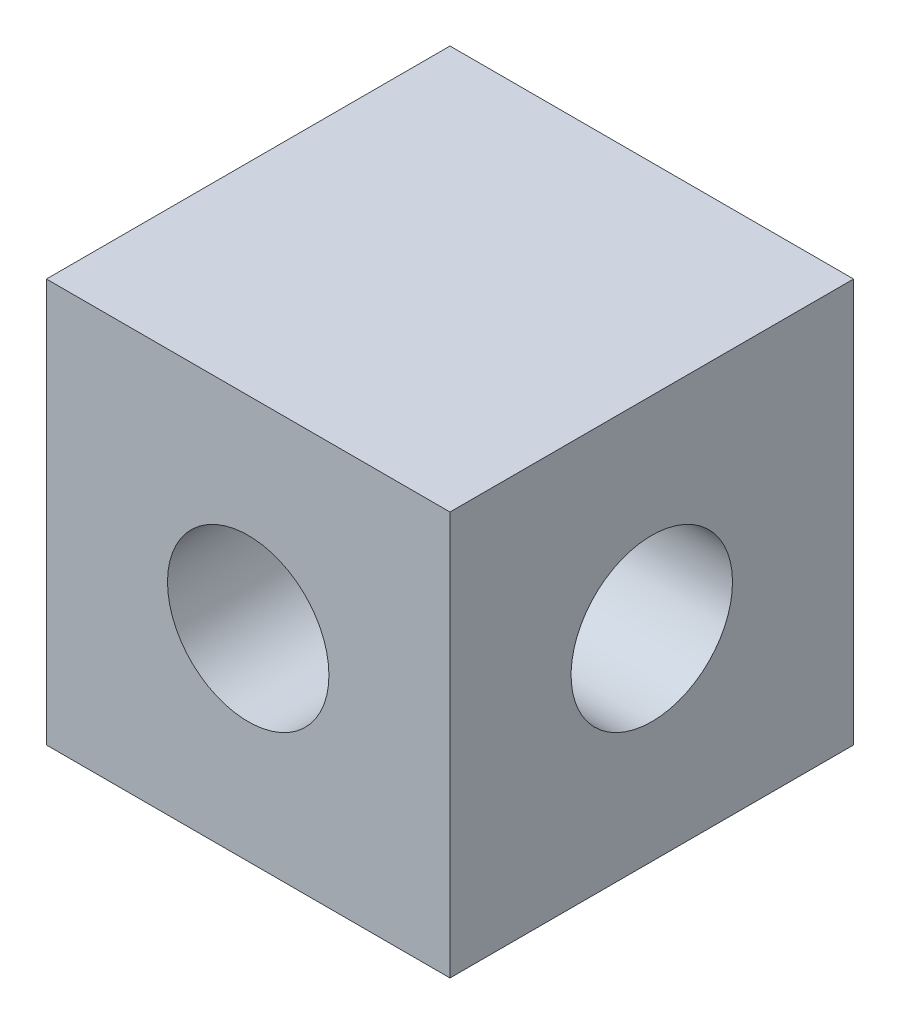
ISO-10303-21;
HEADER;
FILE_DESCRIPTION(('STEP AP214'),'2;1');
FILE_NAME('part.step','',(''),(''),'','','');
FILE_SCHEMA(('AUTOMOTIVE_DESIGN { 1 0 10303 214 1 1 1 1 }'));
ENDSEC;
DATA;
#1=APPLICATION_CONTEXT('core data for automotive mechanical design processes');
#2=APPLICATION_PROTOCOL_DEFINITION('international standard','automotive_design',2000,#1);
#3=PRODUCT_CONTEXT('',#1,'mechanical');
#4=PRODUCT('Part','Part','',(#3));
#5=PRODUCT_RELATED_PRODUCT_CATEGORY('part','',(#4));
#6=PRODUCT_DEFINITION_FORMATION('','',#4);
#7=PRODUCT_DEFINITION_CONTEXT('part definition',#1,'design');
#8=PRODUCT_DEFINITION('design','',#6,#7);
#9=PRODUCT_DEFINITION_SHAPE('','',#8);
#10=(LENGTH_UNIT() NAMED_UNIT(*) SI_UNIT(.MILLI.,.METRE.));
#11=(NAMED_UNIT(*) PLANE_ANGLE_UNIT() SI_UNIT($,.RADIAN.));
#12=(NAMED_UNIT(*) SI_UNIT($,.STERADIAN.) SOLID_ANGLE_UNIT());
#13=UNCERTAINTY_MEASURE_WITH_UNIT(LENGTH_MEASURE(1.E-05),#10,'distance_accuracy_value','');
#14=(GEOMETRIC_REPRESENTATION_CONTEXT(3) GLOBAL_UNCERTAINTY_ASSIGNED_CONTEXT((#13)) GLOBAL_UNIT_ASSIGNED_CONTEXT((#10,
#11,#12)) REPRESENTATION_CONTEXT('',''));
#15=CARTESIAN_POINT('',(0.,0.,0.));
#16=DIRECTION('',(0.,0.,1.));
#17=DIRECTION('',(1.,0.,0.));
#18=AXIS2_PLACEMENT_3D('',#15,#16,#17);
#19=CARTESIAN_POINT('',(10.,0.,0.));
#20=DIRECTION('',(-1.,0.,0.));
#21=DIRECTION('',(0.,0.,1.));
#22=AXIS2_PLACEMENT_3D('',#19,#20,#21);
#23=CYLINDRICAL_SURFACE('',#22,2.);
#24=CARTESIAN_POINT('',(5.,0.,0.));
#25=DIRECTION('',(-0.707106781186547,0.,-0.707106781186547));
#26=DIRECTION('',(-0.707106781186547,0.,0.707106781186547));
#27=AXIS2_PLACEMENT_3D('',#24,#25,#26);
#28=ELLIPSE('',#27,2.82842712474619,2.);
#29=CARTESIAN_POINT('',(5.,-2.,0.));
#30=VERTEX_POINT('',#29);
#31=CARTESIAN_POINT('',(5.,2.,0.));
#32=VERTEX_POINT('',#31);
#33=EDGE_CURVE('E11',#30,#32,#28,.F.);
#34=ORIENTED_EDGE('',*,*,#33,.F.);
#35=CARTESIAN_POINT('',(5.,0.,0.));
#36=DIRECTION('',(-0.707106781186547,0.,0.707106781186547));
#37=DIRECTION('',(-0.707106781186547,0.,-0.707106781186547));
#38=AXIS2_PLACEMENT_3D('',#35,#36,#37);
#39=ELLIPSE('',#38,2.82842712474619,2.);
#40=EDGE_CURVE('E47',#32,#30,#39,.F.);
#41=ORIENTED_EDGE('',*,*,#40,.F.);
#42=EDGE_LOOP('',(#34,#41));
#43=FACE_BOUND('',#42,.T.);
#44=CARTESIAN_POINT('',(10.,0.,0.));
#45=DIRECTION('',(1.,0.,0.));
#46=DIRECTION('',(0.,0.,-1.));
#47=AXIS2_PLACEMENT_3D('',#44,#45,#46);
#48=CIRCLE('',#47,2.);
#49=CARTESIAN_POINT('',(10.,0.,-2.));
#50=VERTEX_POINT('',#49);
#51=EDGE_CURVE('E122',#50,#50,#48,.T.);
#52=ORIENTED_EDGE('',*,*,#51,.T.);
#53=EDGE_LOOP('',(#52));
#54=FACE_BOUND('',#53,.T.);
#55=ADVANCED_FACE('F33',(#43,#54),#23,.F.);
#56=CARTESIAN_POINT('',(10.,0.,0.));
#57=DIRECTION('',(-1.,0.,0.));
#58=DIRECTION('',(0.,0.,1.));
#59=AXIS2_PLACEMENT_3D('',#56,#57,#58);
#60=PLANE('',#59);
#61=DIRECTION('',(0.,1.,0.));
#62=VECTOR('',#61,1.);
#63=CARTESIAN_POINT('',(10.,-5.,-5.));
#64=LINE('',#63,#62);
#65=CARTESIAN_POINT('',(10.,-5.,-5.));
#66=VERTEX_POINT('',#65);
#67=CARTESIAN_POINT('',(10.,5.,-5.));
#68=VERTEX_POINT('',#67);
#69=EDGE_CURVE('E114',#66,#68,#64,.T.);
#70=ORIENTED_EDGE('',*,*,#69,.T.);
#71=DIRECTION('',(0.,0.,1.));
#72=VECTOR('',#71,1.);
#73=CARTESIAN_POINT('',(10.,5.,5.));
#74=LINE('',#73,#72);
#75=CARTESIAN_POINT('',(10.,5.,5.));
#76=VERTEX_POINT('',#75);
#77=EDGE_CURVE('E85',#68,#76,#74,.T.);
#78=ORIENTED_EDGE('',*,*,#77,.T.);
#79=DIRECTION('',(0.,-1.,0.));
#80=VECTOR('',#79,1.);
#81=CARTESIAN_POINT('',(10.,-5.,5.));
#82=LINE('',#81,#80);
#83=CARTESIAN_POINT('',(10.,-5.,5.));
#84=VERTEX_POINT('',#83);
#85=EDGE_CURVE('E124',#76,#84,#82,.T.);
#86=ORIENTED_EDGE('',*,*,#85,.T.);
#87=DIRECTION('',(0.,0.,-1.));
#88=VECTOR('',#87,1.);
#89=CARTESIAN_POINT('',(10.,-5.,5.));
#90=LINE('',#89,#88);
#91=EDGE_CURVE('E56',#84,#66,#90,.T.);
#92=ORIENTED_EDGE('',*,*,#91,.T.);
#93=EDGE_LOOP('',(#70,#78,#86,#92));
#94=FACE_BOUND('',#93,.T.);
#95=ORIENTED_EDGE('',*,*,#51,.F.);
#96=EDGE_LOOP('',(#95));
#97=FACE_BOUND('',#96,.T.);
#98=ADVANCED_FACE('F152',(#94,#97),#60,.F.);
#99=CARTESIAN_POINT('',(0.,0.,0.));
#100=DIRECTION('',(-1.,0.,0.));
#101=DIRECTION('',(0.,0.,1.));
#102=AXIS2_PLACEMENT_3D('',#99,#100,#101);
#103=PLANE('',#102);
#104=DIRECTION('',(0.,1.,0.));
#105=VECTOR('',#104,1.);
#106=CARTESIAN_POINT('',(0.,-5.,-5.));
#107=LINE('',#106,#105);
#108=CARTESIAN_POINT('',(0.,-5.,-5.));
#109=VERTEX_POINT('',#108);
#110=CARTESIAN_POINT('',(0.,5.,-5.));
#111=VERTEX_POINT('',#110);
#112=EDGE_CURVE('E119',#109,#111,#107,.T.);
#113=ORIENTED_EDGE('',*,*,#112,.F.);
#114=DIRECTION('',(0.,0.,-1.));
#115=VECTOR('',#114,1.);
#116=CARTESIAN_POINT('',(0.,-5.,5.));
#117=LINE('',#116,#115);
#118=CARTESIAN_POINT('',(0.,-5.,5.));
#119=VERTEX_POINT('',#118);
#120=EDGE_CURVE('E77',#119,#109,#117,.T.);
#121=ORIENTED_EDGE('',*,*,#120,.F.);
#122=DIRECTION('',(0.,-1.,0.));
#123=VECTOR('',#122,1.);
#124=CARTESIAN_POINT('',(0.,-5.,5.));
#125=LINE('',#124,#123);
#126=CARTESIAN_POINT('',(0.,5.,5.));
#127=VERTEX_POINT('',#126);
#128=EDGE_CURVE('E115',#127,#119,#125,.T.);
#129=ORIENTED_EDGE('',*,*,#128,.F.);
#130=DIRECTION('',(0.,0.,1.));
#131=VECTOR('',#130,1.);
#132=CARTESIAN_POINT('',(0.,5.,5.));
#133=LINE('',#132,#131);
#134=EDGE_CURVE('E117',#111,#127,#133,.T.);
#135=ORIENTED_EDGE('',*,*,#134,.F.);
#136=EDGE_LOOP('',(#113,#121,#129,#135));
#137=FACE_BOUND('',#136,.T.);
#138=CARTESIAN_POINT('',(0.,0.,0.));
#139=DIRECTION('',(1.,0.,0.));
#140=DIRECTION('',(0.,0.,-1.));
#141=AXIS2_PLACEMENT_3D('',#138,#139,#140);
#142=CIRCLE('',#141,2.);
#143=CARTESIAN_POINT('',(0.,0.,-2.));
#144=VERTEX_POINT('',#143);
#145=EDGE_CURVE('E128',#144,#144,#142,.T.);
#146=ORIENTED_EDGE('',*,*,#145,.T.);
#147=EDGE_LOOP('',(#146));
#148=FACE_BOUND('',#147,.T.);
#149=ADVANCED_FACE('F158',(#137,#148),#103,.T.);
#150=CARTESIAN_POINT('',(10.,-5.,-5.));
#151=DIRECTION('',(0.,0.,1.));
#152=DIRECTION('',(1.,0.,0.));
#153=AXIS2_PLACEMENT_3D('',#150,#151,#152);
#154=PLANE('',#153);
#155=CARTESIAN_POINT('',(5.,0.,-5.));
#156=DIRECTION('',(0.,0.,-1.));
#157=DIRECTION('',(-1.,0.,0.));
#158=AXIS2_PLACEMENT_3D('',#155,#156,#157);
#159=CIRCLE('',#158,2.);
#160=CARTESIAN_POINT('',(3.,0.,-5.));
#161=VERTEX_POINT('',#160);
#162=EDGE_CURVE('E134',#161,#161,#159,.T.);
#163=ORIENTED_EDGE('',*,*,#162,.F.);
#164=EDGE_LOOP('',(#163));
#165=FACE_BOUND('',#164,.T.);
#166=ORIENTED_EDGE('',*,*,#112,.T.);
#167=DIRECTION('',(-1.,0.,0.));
#168=VECTOR('',#167,1.);
#169=CARTESIAN_POINT('',(10.,5.,-5.));
#170=LINE('',#169,#168);
#171=EDGE_CURVE('E99',#68,#111,#170,.T.);
#172=ORIENTED_EDGE('',*,*,#171,.F.);
#173=ORIENTED_EDGE('',*,*,#69,.F.);
#174=DIRECTION('',(-1.,0.,0.));
#175=VECTOR('',#174,1.);
#176=CARTESIAN_POINT('',(10.,-5.,-5.));
#177=LINE('',#176,#175);
#178=EDGE_CURVE('E111',#66,#109,#177,.T.);
#179=ORIENTED_EDGE('',*,*,#178,.T.);
#180=EDGE_LOOP('',(#166,#172,#173,#179));
#181=FACE_BOUND('',#180,.T.);
#182=ADVANCED_FACE('F35',(#165,#181),#154,.F.);
#183=CARTESIAN_POINT('',(10.,5.,5.));
#184=DIRECTION('',(0.,-1.,0.));
#185=DIRECTION('',(0.,0.,-1.));
#186=AXIS2_PLACEMENT_3D('',#183,#184,#185);
#187=PLANE('',#186);
#188=ORIENTED_EDGE('',*,*,#134,.T.);
#189=DIRECTION('',(-1.,0.,0.));
#190=VECTOR('',#189,1.);
#191=CARTESIAN_POINT('',(10.,5.,5.));
#192=LINE('',#191,#190);
#193=EDGE_CURVE('E106',#76,#127,#192,.T.);
#194=ORIENTED_EDGE('',*,*,#193,.F.);
#195=ORIENTED_EDGE('',*,*,#77,.F.);
#196=ORIENTED_EDGE('',*,*,#171,.T.);
#197=EDGE_LOOP('',(#188,#194,#195,#196));
#198=FACE_BOUND('',#197,.T.);
#199=ADVANCED_FACE('F167',(#198),#187,.F.);
#200=CARTESIAN_POINT('',(10.,-5.,5.));
#201=DIRECTION('',(0.,0.,-1.));
#202=DIRECTION('',(-1.,0.,0.));
#203=AXIS2_PLACEMENT_3D('',#200,#201,#202);
#204=PLANE('',#203);
#205=CARTESIAN_POINT('',(5.,0.,5.));
#206=DIRECTION('',(0.,0.,-1.));
#207=DIRECTION('',(-1.,0.,0.));
#208=AXIS2_PLACEMENT_3D('',#205,#206,#207);
#209=CIRCLE('',#208,2.);
#210=CARTESIAN_POINT('',(3.,0.,5.));
#211=VERTEX_POINT('',#210);
#212=EDGE_CURVE('E131',#211,#211,#209,.T.);
#213=ORIENTED_EDGE('',*,*,#212,.T.);
#214=EDGE_LOOP('',(#213));
#215=FACE_BOUND('',#214,.T.);
#216=ORIENTED_EDGE('',*,*,#128,.T.);
#217=DIRECTION('',(-1.,0.,0.));
#218=VECTOR('',#217,1.);
#219=CARTESIAN_POINT('',(10.,-5.,5.));
#220=LINE('',#219,#218);
#221=EDGE_CURVE('E109',#84,#119,#220,.T.);
#222=ORIENTED_EDGE('',*,*,#221,.F.);
#223=ORIENTED_EDGE('',*,*,#85,.F.);
#224=ORIENTED_EDGE('',*,*,#193,.T.);
#225=EDGE_LOOP('',(#216,#222,#223,#224));
#226=FACE_BOUND('',#225,.T.);
#227=ADVANCED_FACE('F140',(#215,#226),#204,.F.);
#228=CARTESIAN_POINT('',(10.,-5.,5.));
#229=DIRECTION('',(0.,1.,0.));
#230=DIRECTION('',(0.,0.,1.));
#231=AXIS2_PLACEMENT_3D('',#228,#229,#230);
#232=PLANE('',#231);
#233=ORIENTED_EDGE('',*,*,#120,.T.);
#234=ORIENTED_EDGE('',*,*,#178,.F.);
#235=ORIENTED_EDGE('',*,*,#91,.F.);
#236=ORIENTED_EDGE('',*,*,#221,.T.);
#237=EDGE_LOOP('',(#233,#234,#235,#236));
#238=FACE_BOUND('',#237,.T.);
#239=ADVANCED_FACE('F149',(#238),#232,.F.);
#240=CARTESIAN_POINT('',(5.,0.,0.));
#241=DIRECTION('',(-0.707106781186547,0.,-0.707106781186547));
#242=DIRECTION('',(-0.707106781186547,0.,0.707106781186547));
#243=AXIS2_PLACEMENT_3D('',#240,#241,#242);
#244=ELLIPSE('',#243,2.82842712474619,2.);
#245=EDGE_CURVE('E41',#30,#32,#244,.T.);
#246=ORIENTED_EDGE('',*,*,#245,.F.);
#247=CARTESIAN_POINT('',(5.,0.,0.));
#248=DIRECTION('',(-0.707106781186547,0.,0.707106781186547));
#249=DIRECTION('',(-0.707106781186547,0.,-0.707106781186547));
#250=AXIS2_PLACEMENT_3D('',#247,#248,#249);
#251=ELLIPSE('',#250,2.82842712474619,2.);
#252=EDGE_CURVE('E90',#32,#30,#251,.T.);
#253=ORIENTED_EDGE('',*,*,#252,.F.);
#254=EDGE_LOOP('',(#246,#253));
#255=FACE_BOUND('',#254,.T.);
#256=ORIENTED_EDGE('',*,*,#145,.F.);
#257=EDGE_LOOP('',(#256));
#258=FACE_BOUND('',#257,.T.);
#259=ADVANCED_FACE('F102',(#255,#258),#23,.F.);
#260=CARTESIAN_POINT('',(5.,0.,5.));
#261=DIRECTION('',(0.,0.,-1.));
#262=DIRECTION('',(-1.,0.,0.));
#263=AXIS2_PLACEMENT_3D('',#260,#261,#262);
#264=CYLINDRICAL_SURFACE('',#263,2.);
#265=ORIENTED_EDGE('',*,*,#245,.T.);
#266=ORIENTED_EDGE('',*,*,#40,.T.);
#267=EDGE_LOOP('',(#265,#266));
#268=FACE_BOUND('',#267,.T.);
#269=ORIENTED_EDGE('',*,*,#212,.F.);
#270=EDGE_LOOP('',(#269));
#271=FACE_BOUND('',#270,.T.);
#272=ADVANCED_FACE('F97',(#268,#271),#264,.F.);
#273=ORIENTED_EDGE('',*,*,#33,.T.);
#274=ORIENTED_EDGE('',*,*,#252,.T.);
#275=EDGE_LOOP('',(#273,#274));
#276=FACE_BOUND('',#275,.T.);
#277=ORIENTED_EDGE('',*,*,#162,.T.);
#278=EDGE_LOOP('',(#277));
#279=FACE_BOUND('',#278,.T.);
#280=ADVANCED_FACE('F91',(#276,#279),#264,.F.);
#281=CLOSED_SHELL('',(#55,#98,#149,#182,#199,#227,#239,#259,#272,#280));
#282=MANIFOLD_SOLID_BREP('B2',#281);
#283=ADVANCED_BREP_SHAPE_REPRESENTATION('',(#18,#282),#14);
#284=SHAPE_DEFINITION_REPRESENTATION(#9,#283);
ENDSEC;
END-ISO-10303-21;
